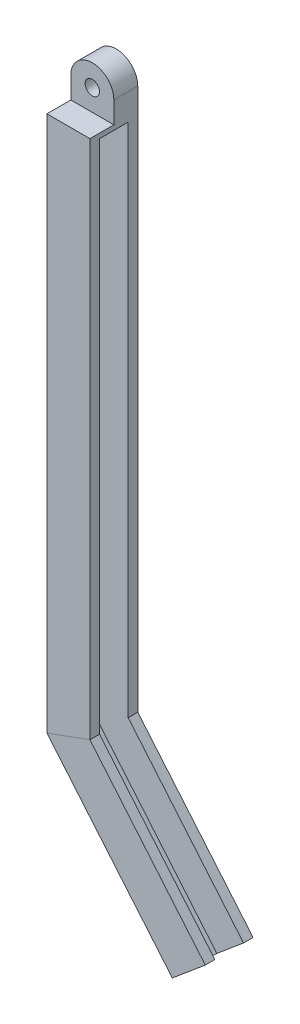
ISO-10303-21;
HEADER;
FILE_DESCRIPTION(('STEP AP214'),'2;1');
FILE_NAME('part.step','',(''),(''),'','','');
FILE_SCHEMA(('AUTOMOTIVE_DESIGN { 1 0 10303 214 1 1 1 1 }'));
ENDSEC;
DATA;
#1=APPLICATION_CONTEXT('core data for automotive mechanical design processes');
#2=APPLICATION_PROTOCOL_DEFINITION('international standard','automotive_design',2000,#1);
#3=PRODUCT_CONTEXT('',#1,'mechanical');
#4=PRODUCT('Part','Part','',(#3));
#5=PRODUCT_RELATED_PRODUCT_CATEGORY('part','',(#4));
#6=PRODUCT_DEFINITION_FORMATION('','',#4);
#7=PRODUCT_DEFINITION_CONTEXT('part definition',#1,'design');
#8=PRODUCT_DEFINITION('design','',#6,#7);
#9=PRODUCT_DEFINITION_SHAPE('','',#8);
#10=(LENGTH_UNIT() NAMED_UNIT(*) SI_UNIT(.MILLI.,.METRE.));
#11=(NAMED_UNIT(*) PLANE_ANGLE_UNIT() SI_UNIT($,.RADIAN.));
#12=(NAMED_UNIT(*) SI_UNIT($,.STERADIAN.) SOLID_ANGLE_UNIT());
#13=UNCERTAINTY_MEASURE_WITH_UNIT(LENGTH_MEASURE(1.E-05),#10,'distance_accuracy_value','');
#14=(GEOMETRIC_REPRESENTATION_CONTEXT(3) GLOBAL_UNCERTAINTY_ASSIGNED_CONTEXT((#13)) GLOBAL_UNIT_ASSIGNED_CONTEXT((#10,
#11,#12)) REPRESENTATION_CONTEXT('',''));
#15=CARTESIAN_POINT('',(0.,0.,0.));
#16=DIRECTION('',(0.,0.,1.));
#17=DIRECTION('',(1.,0.,0.));
#18=AXIS2_PLACEMENT_3D('',#15,#16,#17);
#19=CARTESIAN_POINT('',(-17.5751587734943,-105.650705303768,-1.04285714285714));
#20=DIRECTION('',(-0.766044443118977,-0.64278760968654,0.));
#21=DIRECTION('',(0.64278760968654,-0.766044443118977,0.));
#22=AXIS2_PLACEMENT_3D('',#19,#20,#21);
#23=PLANE('',#22);
#24=DIRECTION('',(0.,0.,-1.));
#25=VECTOR('',#24,1.);
#26=CARTESIAN_POINT('',(8.82018892935389,-137.107455756411,-1.04285714285714));
#27=LINE('',#26,#25);
#28=CARTESIAN_POINT('',(8.82018892935388,-137.107455756411,8.95714285714286));
#29=VERTEX_POINT('',#28);
#30=CARTESIAN_POINT('',(8.82018892935393,-137.107455756411,6.95714285714286));
#31=VERTEX_POINT('',#30);
#32=EDGE_CURVE('E289',#29,#31,#27,.T.);
#33=ORIENTED_EDGE('',*,*,#32,.T.);
#34=DIRECTION('',(0.64278760968654,-0.766044443118977,0.));
#35=VECTOR('',#34,1.);
#36=CARTESIAN_POINT('',(-16.8913154581077,-106.465678031652,6.95714285714286));
#37=LINE('',#36,#35);
#38=CARTESIAN_POINT('',(-15.3,-108.362133945802,6.95714285714286));
#39=VERTEX_POINT('',#38);
#40=EDGE_CURVE('E188',#39,#31,#37,.T.);
#41=ORIENTED_EDGE('',*,*,#40,.F.);
#42=DIRECTION('',(0.,0.,1.));
#43=VECTOR('',#42,1.);
#44=CARTESIAN_POINT('',(-15.3,-108.362133945802,-1.04285714285714));
#45=LINE('',#44,#43);
#46=CARTESIAN_POINT('',(-15.3,-108.362133945802,8.95714285714286));
#47=VERTEX_POINT('',#46);
#48=EDGE_CURVE('E279',#39,#47,#45,.T.);
#49=ORIENTED_EDGE('',*,*,#48,.T.);
#50=DIRECTION('',(0.64278760968654,-0.766044443118977,0.));
#51=VECTOR('',#50,1.);
#52=CARTESIAN_POINT('',(-17.5751587734943,-105.650705303768,8.95714285714286));
#53=LINE('',#52,#51);
#54=EDGE_CURVE('E305',#47,#29,#53,.T.);
#55=ORIENTED_EDGE('',*,*,#54,.T.);
#56=EDGE_LOOP('',(#33,#41,#49,#55));
#57=FACE_BOUND('',#56,.T.);
#58=ADVANCED_FACE('F39',(#57),#23,.F.);
#59=CARTESIAN_POINT('',(-15.3,10.,-1.04285714285714));
#60=DIRECTION('',(-1.,0.,0.));
#61=DIRECTION('',(0.,0.,1.));
#62=AXIS2_PLACEMENT_3D('',#59,#60,#61);
#63=PLANE('',#62);
#64=DIRECTION('',(0.,0.,-1.));
#65=VECTOR('',#64,1.);
#66=CARTESIAN_POINT('',(-15.3,-0.5,0.957142857142858));
#67=LINE('',#66,#65);
#68=CARTESIAN_POINT('',(-15.3,-0.5,6.95714285714286));
#69=VERTEX_POINT('',#68);
#70=CARTESIAN_POINT('',(-15.3,-0.5,0.957142857142858));
#71=VERTEX_POINT('',#70);
#72=EDGE_CURVE('E202',#69,#71,#67,.T.);
#73=ORIENTED_EDGE('',*,*,#72,.T.);
#74=DIRECTION('',(0.,1.,0.));
#75=VECTOR('',#74,1.);
#76=CARTESIAN_POINT('',(-15.3,-110.5,0.957142857142858));
#77=LINE('',#76,#75);
#78=CARTESIAN_POINT('',(-15.3,-108.362133945802,0.957142857142858));
#79=VERTEX_POINT('',#78);
#80=EDGE_CURVE('E223',#79,#71,#77,.T.);
#81=ORIENTED_EDGE('',*,*,#80,.F.);
#82=CARTESIAN_POINT('',(-15.3,-108.362133945802,-1.04285714285714));
#83=VERTEX_POINT('',#82);
#84=EDGE_CURVE('E275',#83,#79,#45,.T.);
#85=ORIENTED_EDGE('',*,*,#84,.F.);
#86=DIRECTION('',(0.,-1.,0.));
#87=VECTOR('',#86,1.);
#88=CARTESIAN_POINT('',(-15.3,10.,-1.04285714285714));
#89=LINE('',#88,#87);
#90=CARTESIAN_POINT('',(-15.3,5.,-1.04285714285714));
#91=VERTEX_POINT('',#90);
#92=EDGE_CURVE('E323',#91,#83,#89,.T.);
#93=ORIENTED_EDGE('',*,*,#92,.F.);
#94=DIRECTION('',(0.,0.,1.));
#95=VECTOR('',#94,1.);
#96=CARTESIAN_POINT('',(-15.3,5.,-1.04285714285714));
#97=LINE('',#96,#95);
#98=CARTESIAN_POINT('',(-15.3,5.,3.95714285714286));
#99=VERTEX_POINT('',#98);
#100=EDGE_CURVE('E313',#91,#99,#97,.T.);
#101=ORIENTED_EDGE('',*,*,#100,.T.);
#102=DIRECTION('',(0.,1.,0.));
#103=VECTOR('',#102,1.);
#104=CARTESIAN_POINT('',(-15.3,0.5,3.95714285714286));
#105=LINE('',#104,#103);
#106=CARTESIAN_POINT('',(-15.3,0.5,3.95714285714286));
#107=VERTEX_POINT('',#106);
#108=EDGE_CURVE('E62',#107,#99,#105,.T.);
#109=ORIENTED_EDGE('',*,*,#108,.F.);
#110=DIRECTION('',(0.,0.,-1.));
#111=VECTOR('',#110,1.);
#112=CARTESIAN_POINT('',(-15.3,0.5,13.9571428571429));
#113=LINE('',#112,#111);
#114=CARTESIAN_POINT('',(-15.3,0.5,8.95714285714286));
#115=VERTEX_POINT('',#114);
#116=EDGE_CURVE('E254',#115,#107,#113,.T.);
#117=ORIENTED_EDGE('',*,*,#116,.F.);
#118=DIRECTION('',(0.,-1.,0.));
#119=VECTOR('',#118,1.);
#120=CARTESIAN_POINT('',(-15.3,10.,8.95714285714286));
#121=LINE('',#120,#119);
#122=EDGE_CURVE('E326',#115,#47,#121,.T.);
#123=ORIENTED_EDGE('',*,*,#122,.T.);
#124=ORIENTED_EDGE('',*,*,#48,.F.);
#125=DIRECTION('',(0.,1.,0.));
#126=VECTOR('',#125,1.);
#127=CARTESIAN_POINT('',(-15.3,-110.5,6.95714285714286));
#128=LINE('',#127,#126);
#129=EDGE_CURVE('E227',#39,#69,#128,.T.);
#130=ORIENTED_EDGE('',*,*,#129,.T.);
#131=EDGE_LOOP('',(#73,#81,#85,#93,#101,#109,#117,#123,#124,#130));
#132=FACE_BOUND('',#131,.T.);
#133=ADVANCED_FACE('F342',(#132),#63,.F.);
#134=CARTESIAN_POINT('',(-24.3,10.,8.95714285714286));
#135=DIRECTION('',(1.,0.,0.));
#136=DIRECTION('',(0.,0.,-1.));
#137=AXIS2_PLACEMENT_3D('',#134,#135,#136);
#138=PLANE('',#137);
#139=DIRECTION('',(0.,0.,-1.));
#140=VECTOR('',#139,1.);
#141=CARTESIAN_POINT('',(-24.3,0.5,13.9571428571429));
#142=LINE('',#141,#140);
#143=CARTESIAN_POINT('',(-24.3,0.5,8.95714285714286));
#144=VERTEX_POINT('',#143);
#145=CARTESIAN_POINT('',(-24.3,0.5,3.95714285714286));
#146=VERTEX_POINT('',#145);
#147=EDGE_CURVE('E257',#144,#146,#142,.T.);
#148=ORIENTED_EDGE('',*,*,#147,.T.);
#149=DIRECTION('',(0.,-1.,0.));
#150=VECTOR('',#149,1.);
#151=CARTESIAN_POINT('',(-24.3,4.99999999999997,3.95714285714286));
#152=LINE('',#151,#150);
#153=CARTESIAN_POINT('',(-24.3,4.99999999999997,3.95714285714286));
#154=VERTEX_POINT('',#153);
#155=EDGE_CURVE('E246',#154,#146,#152,.T.);
#156=ORIENTED_EDGE('',*,*,#155,.F.);
#157=DIRECTION('',(0.,0.,1.));
#158=VECTOR('',#157,1.);
#159=CARTESIAN_POINT('',(-24.3,5.,-1.04285714285714));
#160=LINE('',#159,#158);
#161=CARTESIAN_POINT('',(-24.3,5.,-1.04285714285714));
#162=VERTEX_POINT('',#161);
#163=EDGE_CURVE('E312',#162,#154,#160,.T.);
#164=ORIENTED_EDGE('',*,*,#163,.F.);
#165=DIRECTION('',(0.,-1.,0.));
#166=VECTOR('',#165,1.);
#167=CARTESIAN_POINT('',(-24.3,10.,-1.04285714285714));
#168=LINE('',#167,#166);
#169=CARTESIAN_POINT('',(-24.3,-111.637866054198,-1.04285714285714));
#170=VERTEX_POINT('',#169);
#171=EDGE_CURVE('E317',#162,#170,#168,.T.);
#172=ORIENTED_EDGE('',*,*,#171,.T.);
#173=DIRECTION('',(0.,0.,-1.));
#174=VECTOR('',#173,1.);
#175=CARTESIAN_POINT('',(-24.3,-111.637866054198,8.95714285714284));
#176=LINE('',#175,#174);
#177=CARTESIAN_POINT('',(-24.3,-111.637866054198,8.95714285714286));
#178=VERTEX_POINT('',#177);
#179=EDGE_CURVE('E267',#178,#170,#176,.T.);
#180=ORIENTED_EDGE('',*,*,#179,.F.);
#181=DIRECTION('',(0.,-1.,0.));
#182=VECTOR('',#181,1.);
#183=CARTESIAN_POINT('',(-24.3,10.,8.95714285714286));
#184=LINE('',#183,#182);
#185=EDGE_CURVE('E330',#144,#178,#184,.T.);
#186=ORIENTED_EDGE('',*,*,#185,.F.);
#187=EDGE_LOOP('',(#148,#156,#164,#172,#180,#186));
#188=FACE_BOUND('',#187,.T.);
#189=ADVANCED_FACE('F41',(#188),#138,.F.);
#190=CARTESIAN_POINT('',(-15.3,10.,8.95714285714286));
#191=DIRECTION('',(0.,0.,-1.));
#192=DIRECTION('',(-1.,0.,0.));
#193=AXIS2_PLACEMENT_3D('',#190,#191,#192);
#194=PLANE('',#193);
#195=DIRECTION('',(1.,0.,0.));
#196=VECTOR('',#195,1.);
#197=CARTESIAN_POINT('',(-15.3,0.5,8.95714285714286));
#198=LINE('',#197,#196);
#199=EDGE_CURVE('E48',#144,#115,#198,.T.);
#200=ORIENTED_EDGE('',*,*,#199,.F.);
#201=ORIENTED_EDGE('',*,*,#185,.T.);
#202=DIRECTION('',(-0.939692620785908,-0.342020143325669,0.));
#203=VECTOR('',#202,1.);
#204=CARTESIAN_POINT('',(19.5269185297774,-95.686172249749,8.95714285714286));
#205=LINE('',#204,#203);
#206=EDGE_CURVE('E271',#47,#178,#205,.T.);
#207=ORIENTED_EDGE('',*,*,#206,.F.);
#208=ORIENTED_EDGE('',*,*,#122,.F.);
#209=EDGE_LOOP('',(#200,#201,#207,#208));
#210=FACE_BOUND('',#209,.T.);
#211=ADVANCED_FACE('F345',(#210),#194,.F.);
#212=CARTESIAN_POINT('',(-24.3,10.,-1.04285714285714));
#213=DIRECTION('',(0.,0.,1.));
#214=DIRECTION('',(1.,0.,0.));
#215=AXIS2_PLACEMENT_3D('',#212,#213,#214);
#216=PLANE('',#215);
#217=CARTESIAN_POINT('',(-19.8,4.99999999999998,-1.04285714285714));
#218=DIRECTION('',(0.,0.,1.));
#219=DIRECTION('',(1.,0.,0.));
#220=AXIS2_PLACEMENT_3D('',#217,#218,#219);
#221=CIRCLE('',#220,1.5);
#222=CARTESIAN_POINT('',(-18.3,4.99999999999998,-1.04285714285714));
#223=VERTEX_POINT('',#222);
#224=EDGE_CURVE('E239',#223,#223,#221,.T.);
#225=ORIENTED_EDGE('',*,*,#224,.T.);
#226=EDGE_LOOP('',(#225));
#227=FACE_BOUND('',#226,.T.);
#228=ORIENTED_EDGE('',*,*,#171,.F.);
#229=CARTESIAN_POINT('',(-19.8,5.,-1.04285714285714));
#230=DIRECTION('',(0.,0.,-1.));
#231=DIRECTION('',(-1.,0.,0.));
#232=AXIS2_PLACEMENT_3D('',#229,#230,#231);
#233=CIRCLE('',#232,4.5);
#234=EDGE_CURVE('E266',#162,#91,#233,.T.);
#235=ORIENTED_EDGE('',*,*,#234,.T.);
#236=ORIENTED_EDGE('',*,*,#92,.T.);
#237=DIRECTION('',(0.939692620785908,0.342020143325669,0.));
#238=VECTOR('',#237,1.);
#239=CARTESIAN_POINT('',(11.579718535742,-98.5787164933384,-1.04285714285714));
#240=LINE('',#239,#238);
#241=EDGE_CURVE('E262',#170,#83,#240,.T.);
#242=ORIENTED_EDGE('',*,*,#241,.F.);
#243=EDGE_LOOP('',(#228,#235,#236,#242));
#244=FACE_BOUND('',#243,.T.);
#245=ADVANCED_FACE('F370',(#227,#244),#216,.F.);
#246=CARTESIAN_POINT('',(-19.8,5.,-1.04285714285714));
#247=DIRECTION('',(0.,0.,1.));
#248=DIRECTION('',(1.,0.,0.));
#249=AXIS2_PLACEMENT_3D('',#246,#247,#248);
#250=CYLINDRICAL_SURFACE('',#249,4.5);
#251=ORIENTED_EDGE('',*,*,#163,.T.);
#252=CARTESIAN_POINT('',(-19.8,4.99999999999998,3.95714285714286));
#253=DIRECTION('',(0.,0.,1.));
#254=DIRECTION('',(-1.,0.,0.));
#255=AXIS2_PLACEMENT_3D('',#252,#253,#254);
#256=CIRCLE('',#255,4.5);
#257=EDGE_CURVE('E243',#99,#154,#256,.T.);
#258=ORIENTED_EDGE('',*,*,#257,.F.);
#259=ORIENTED_EDGE('',*,*,#100,.F.);
#260=ORIENTED_EDGE('',*,*,#234,.F.);
#261=EDGE_LOOP('',(#251,#258,#259,#260));
#262=FACE_BOUND('',#261,.T.);
#263=ADVANCED_FACE('F396',(#262),#250,.T.);
#264=CARTESIAN_POINT('',(20.5406689090742,-127.272805328207,0.));
#265=DIRECTION('',(0.64278760968654,-0.766044443118977,0.));
#266=DIRECTION('',(0.,0.,-1.));
#267=AXIS2_PLACEMENT_3D('',#264,#265,#266);
#268=PLANE('',#267);
#269=DIRECTION('',(-0.766044443118978,-0.64278760968654,0.));
#270=VECTOR('',#269,1.);
#271=CARTESIAN_POINT('',(3.23572493901658,-141.793377431026,6.95714285714286));
#272=LINE('',#271,#270);
#273=CARTESIAN_POINT('',(3.23572493901658,-141.793377431026,6.95714285714286));
#274=VERTEX_POINT('',#273);
#275=EDGE_CURVE('E168',#31,#274,#272,.T.);
#276=ORIENTED_EDGE('',*,*,#275,.F.);
#277=ORIENTED_EDGE('',*,*,#32,.F.);
#278=DIRECTION('',(0.766044443118977,0.64278760968654,0.));
#279=VECTOR('',#278,1.);
#280=CARTESIAN_POINT('',(8.82018892935389,-137.107455756411,8.95714285714286));
#281=LINE('',#280,#279);
#282=CARTESIAN_POINT('',(1.92578894128309,-142.892544243589,8.95714285714286));
#283=VERTEX_POINT('',#282);
#284=EDGE_CURVE('E261',#283,#29,#281,.T.);
#285=ORIENTED_EDGE('',*,*,#284,.F.);
#286=DIRECTION('',(0.,0.,1.));
#287=VECTOR('',#286,1.);
#288=CARTESIAN_POINT('',(1.92578894128309,-142.892544243589,8.95714285714286));
#289=LINE('',#288,#287);
#290=CARTESIAN_POINT('',(1.9257889412831,-142.892544243589,-1.04285714285714));
#291=VERTEX_POINT('',#290);
#292=EDGE_CURVE('E282',#291,#283,#289,.T.);
#293=ORIENTED_EDGE('',*,*,#292,.F.);
#294=DIRECTION('',(-0.766044443118977,-0.64278760968654,0.));
#295=VECTOR('',#294,1.);
#296=CARTESIAN_POINT('',(1.9257889412831,-142.892544243589,-1.04285714285714));
#297=LINE('',#296,#295);
#298=CARTESIAN_POINT('',(8.82018892935388,-137.107455756411,-1.04285714285714));
#299=VERTEX_POINT('',#298);
#300=EDGE_CURVE('E285',#299,#291,#297,.T.);
#301=ORIENTED_EDGE('',*,*,#300,.F.);
#302=CARTESIAN_POINT('',(8.82018892935393,-137.107455756411,0.957142857142858));
#303=VERTEX_POINT('',#302);
#304=EDGE_CURVE('E288',#303,#299,#27,.T.);
#305=ORIENTED_EDGE('',*,*,#304,.F.);
#306=DIRECTION('',(0.766044443118978,0.64278760968654,0.));
#307=VECTOR('',#306,1.);
#308=CARTESIAN_POINT('',(8.82018892935393,-137.107455756411,0.957142857142858));
#309=LINE('',#308,#307);
#310=CARTESIAN_POINT('',(3.23572493901658,-141.793377431026,0.957142857142858));
#311=VERTEX_POINT('',#310);
#312=EDGE_CURVE('E161',#311,#303,#309,.T.);
#313=ORIENTED_EDGE('',*,*,#312,.F.);
#314=DIRECTION('',(0.,0.,-1.));
#315=VECTOR('',#314,1.);
#316=CARTESIAN_POINT('',(3.23572493901658,-141.793377431026,0.957142857142858));
#317=LINE('',#316,#315);
#318=EDGE_CURVE('E183',#274,#311,#317,.T.);
#319=ORIENTED_EDGE('',*,*,#318,.F.);
#320=EDGE_LOOP('',(#276,#277,#285,#293,#301,#305,#313,#319));
#321=FACE_BOUND('',#320,.T.);
#322=ADVANCED_FACE('F363',(#321),#268,.T.);
#323=ORIENTED_EDGE('',*,*,#84,.T.);
#324=DIRECTION('',(0.64278760968654,-0.766044443118977,0.));
#325=VECTOR('',#324,1.);
#326=CARTESIAN_POINT('',(-16.8913154581077,-106.465678031652,0.957142857142858));
#327=LINE('',#326,#325);
#328=EDGE_CURVE('E192',#79,#303,#327,.T.);
#329=ORIENTED_EDGE('',*,*,#328,.T.);
#330=ORIENTED_EDGE('',*,*,#304,.T.);
#331=DIRECTION('',(0.64278760968654,-0.766044443118977,0.));
#332=VECTOR('',#331,1.);
#333=CARTESIAN_POINT('',(-17.5751587734943,-105.650705303768,-1.04285714285714));
#334=LINE('',#333,#332);
#335=EDGE_CURVE('E301',#83,#299,#334,.T.);
#336=ORIENTED_EDGE('',*,*,#335,.F.);
#337=EDGE_LOOP('',(#323,#329,#330,#336));
#338=FACE_BOUND('',#337,.T.);
#339=ADVANCED_FACE('F359',(#338),#23,.F.);
#340=CARTESIAN_POINT('',(-24.4695587615651,-111.435793790947,-1.04285714285714));
#341=DIRECTION('',(0.,0.,1.));
#342=DIRECTION('',(1.,0.,0.));
#343=AXIS2_PLACEMENT_3D('',#340,#341,#342);
#344=PLANE('',#343);
#345=ORIENTED_EDGE('',*,*,#241,.T.);
#346=ORIENTED_EDGE('',*,*,#335,.T.);
#347=ORIENTED_EDGE('',*,*,#300,.T.);
#348=DIRECTION('',(0.64278760968654,-0.766044443118977,0.));
#349=VECTOR('',#348,1.);
#350=CARTESIAN_POINT('',(-24.4695587615651,-111.435793790947,-1.04285714285714));
#351=LINE('',#350,#349);
#352=EDGE_CURVE('E297',#170,#291,#351,.T.);
#353=ORIENTED_EDGE('',*,*,#352,.F.);
#354=EDGE_LOOP('',(#345,#346,#347,#353));
#355=FACE_BOUND('',#354,.T.);
#356=ADVANCED_FACE('F366',(#355),#344,.F.);
#357=CARTESIAN_POINT('',(-24.4695587615651,-111.435793790947,8.95714285714286));
#358=DIRECTION('',(0.766044443118977,0.64278760968654,0.));
#359=DIRECTION('',(-0.64278760968654,0.766044443118977,0.));
#360=AXIS2_PLACEMENT_3D('',#357,#358,#359);
#361=PLANE('',#360);
#362=ORIENTED_EDGE('',*,*,#179,.T.);
#363=ORIENTED_EDGE('',*,*,#352,.T.);
#364=ORIENTED_EDGE('',*,*,#292,.T.);
#365=DIRECTION('',(0.64278760968654,-0.766044443118977,0.));
#366=VECTOR('',#365,1.);
#367=CARTESIAN_POINT('',(-24.4695587615651,-111.435793790947,8.95714285714286));
#368=LINE('',#367,#366);
#369=EDGE_CURVE('E293',#178,#283,#368,.T.);
#370=ORIENTED_EDGE('',*,*,#369,.F.);
#371=EDGE_LOOP('',(#362,#363,#364,#370));
#372=FACE_BOUND('',#371,.T.);
#373=ADVANCED_FACE('F391',(#372),#361,.F.);
#374=CARTESIAN_POINT('',(-17.5751587734943,-105.650705303768,8.95714285714286));
#375=DIRECTION('',(0.,0.,-1.));
#376=DIRECTION('',(-1.,0.,0.));
#377=AXIS2_PLACEMENT_3D('',#374,#375,#376);
#378=PLANE('',#377);
#379=ORIENTED_EDGE('',*,*,#206,.T.);
#380=ORIENTED_EDGE('',*,*,#369,.T.);
#381=ORIENTED_EDGE('',*,*,#284,.T.);
#382=ORIENTED_EDGE('',*,*,#54,.F.);
#383=EDGE_LOOP('',(#379,#380,#381,#382));
#384=FACE_BOUND('',#383,.T.);
#385=ADVANCED_FACE('F349',(#384),#378,.F.);
#386=CARTESIAN_POINT('',(-24.3,0.5,13.9571428571429));
#387=DIRECTION('',(0.,1.,0.));
#388=DIRECTION('',(0.,0.,1.));
#389=AXIS2_PLACEMENT_3D('',#386,#387,#388);
#390=PLANE('',#389);
#391=ORIENTED_EDGE('',*,*,#199,.T.);
#392=ORIENTED_EDGE('',*,*,#116,.T.);
#393=DIRECTION('',(1.,0.,0.));
#394=VECTOR('',#393,1.);
#395=CARTESIAN_POINT('',(-24.3,0.5,3.95714285714286));
#396=LINE('',#395,#394);
#397=EDGE_CURVE('E249',#146,#107,#396,.T.);
#398=ORIENTED_EDGE('',*,*,#397,.F.);
#399=ORIENTED_EDGE('',*,*,#147,.F.);
#400=EDGE_LOOP('',(#391,#392,#398,#399));
#401=FACE_BOUND('',#400,.T.);
#402=ADVANCED_FACE('F336',(#401),#390,.T.);
#403=CARTESIAN_POINT('',(-19.8,4.99999999999998,3.95714285714286));
#404=DIRECTION('',(0.,0.,-1.));
#405=DIRECTION('',(-1.,0.,0.));
#406=AXIS2_PLACEMENT_3D('',#403,#404,#405);
#407=PLANE('',#406);
#408=CARTESIAN_POINT('',(-19.8,4.99999999999998,3.95714285714286));
#409=DIRECTION('',(0.,0.,1.));
#410=DIRECTION('',(1.,0.,0.));
#411=AXIS2_PLACEMENT_3D('',#408,#409,#410);
#412=CIRCLE('',#411,1.5);
#413=CARTESIAN_POINT('',(-18.3,4.99999999999998,3.95714285714286));
#414=VERTEX_POINT('',#413);
#415=EDGE_CURVE('E226',#414,#414,#412,.T.);
#416=ORIENTED_EDGE('',*,*,#415,.F.);
#417=EDGE_LOOP('',(#416));
#418=FACE_BOUND('',#417,.T.);
#419=ORIENTED_EDGE('',*,*,#257,.T.);
#420=ORIENTED_EDGE('',*,*,#155,.T.);
#421=ORIENTED_EDGE('',*,*,#397,.T.);
#422=ORIENTED_EDGE('',*,*,#108,.T.);
#423=EDGE_LOOP('',(#419,#420,#421,#422));
#424=FACE_BOUND('',#423,.T.);
#425=ADVANCED_FACE('F397',(#418,#424),#407,.F.);
#426=CARTESIAN_POINT('',(-19.8,4.99999999999998,-6.04285714285714));
#427=DIRECTION('',(0.,0.,1.));
#428=DIRECTION('',(1.,0.,0.));
#429=AXIS2_PLACEMENT_3D('',#426,#427,#428);
#430=CYLINDRICAL_SURFACE('',#429,1.5);
#431=ORIENTED_EDGE('',*,*,#415,.T.);
#432=EDGE_LOOP('',(#431));
#433=FACE_BOUND('',#432,.T.);
#434=ORIENTED_EDGE('',*,*,#224,.F.);
#435=EDGE_LOOP('',(#434));
#436=FACE_BOUND('',#435,.T.);
#437=ADVANCED_FACE('F399',(#433,#436),#430,.F.);
#438=CARTESIAN_POINT('',(-22.59,-110.5,0.957142857142858));
#439=DIRECTION('',(0.,0.,-1.));
#440=DIRECTION('',(-1.,0.,0.));
#441=AXIS2_PLACEMENT_3D('',#438,#439,#440);
#442=PLANE('',#441);
#443=ORIENTED_EDGE('',*,*,#328,.F.);
#444=ORIENTED_EDGE('',*,*,#80,.T.);
#445=DIRECTION('',(-1.,0.,0.));
#446=VECTOR('',#445,1.);
#447=CARTESIAN_POINT('',(-22.59,-0.5,0.957142857142858));
#448=LINE('',#447,#446);
#449=CARTESIAN_POINT('',(-22.59,-0.5,0.957142857142858));
#450=VERTEX_POINT('',#449);
#451=EDGE_CURVE('E191',#71,#450,#448,.T.);
#452=ORIENTED_EDGE('',*,*,#451,.T.);
#453=DIRECTION('',(0.,1.,0.));
#454=VECTOR('',#453,1.);
#455=CARTESIAN_POINT('',(-22.59,-110.5,0.957142857142858));
#456=LINE('',#455,#454);
#457=CARTESIAN_POINT('',(-22.59,-110.5,0.957142857142858));
#458=VERTEX_POINT('',#457);
#459=EDGE_CURVE('E209',#458,#450,#456,.T.);
#460=ORIENTED_EDGE('',*,*,#459,.F.);
#461=DIRECTION('',(-1.,0.,0.));
#462=VECTOR('',#461,1.);
#463=CARTESIAN_POINT('',(-22.59,-110.5,0.957142857142858));
#464=LINE('',#463,#462);
#465=CARTESIAN_POINT('',(-21.6992331575687,-110.5,0.957142857142858));
#466=VERTEX_POINT('',#465);
#467=EDGE_CURVE('E198',#466,#458,#464,.T.);
#468=ORIENTED_EDGE('',*,*,#467,.F.);
#469=DIRECTION('',(0.766044443118978,0.64278760968654,0.));
#470=VECTOR('',#469,1.);
#471=CARTESIAN_POINT('',(-16.8913154581077,-106.465678031652,0.957142857142858));
#472=LINE('',#471,#470);
#473=CARTESIAN_POINT('',(-22.475779448445,-111.151599706266,0.957142857142858));
#474=VERTEX_POINT('',#473);
#475=EDGE_CURVE('E55',#474,#466,#472,.T.);
#476=ORIENTED_EDGE('',*,*,#475,.F.);
#477=DIRECTION('',(0.64278760968654,-0.766044443118977,0.));
#478=VECTOR('',#477,1.);
#479=CARTESIAN_POINT('',(-22.475779448445,-111.151599706266,0.957142857142858));
#480=LINE('',#479,#478);
#481=EDGE_CURVE('E173',#474,#311,#480,.T.);
#482=ORIENTED_EDGE('',*,*,#481,.T.);
#483=ORIENTED_EDGE('',*,*,#312,.T.);
#484=EDGE_LOOP('',(#443,#444,#452,#460,#468,#476,#482,#483));
#485=FACE_BOUND('',#484,.T.);
#486=ADVANCED_FACE('F377',(#485),#442,.F.);
#487=CARTESIAN_POINT('',(-15.3,-110.5,6.95714285714286));
#488=DIRECTION('',(0.,0.,1.));
#489=DIRECTION('',(1.,0.,0.));
#490=AXIS2_PLACEMENT_3D('',#487,#488,#489);
#491=PLANE('',#490);
#492=ORIENTED_EDGE('',*,*,#129,.F.);
#493=ORIENTED_EDGE('',*,*,#40,.T.);
#494=ORIENTED_EDGE('',*,*,#275,.T.);
#495=DIRECTION('',(0.64278760968654,-0.766044443118977,0.));
#496=VECTOR('',#495,1.);
#497=CARTESIAN_POINT('',(-22.475779448445,-111.151599706266,6.95714285714286));
#498=LINE('',#497,#496);
#499=CARTESIAN_POINT('',(-22.475779448445,-111.151599706266,6.95714285714286));
#500=VERTEX_POINT('',#499);
#501=EDGE_CURVE('E164',#500,#274,#498,.T.);
#502=ORIENTED_EDGE('',*,*,#501,.F.);
#503=DIRECTION('',(-0.766044443118978,-0.64278760968654,0.));
#504=VECTOR('',#503,1.);
#505=CARTESIAN_POINT('',(-22.475779448445,-111.151599706266,6.95714285714286));
#506=LINE('',#505,#504);
#507=CARTESIAN_POINT('',(-21.6992331575687,-110.5,6.95714285714286));
#508=VERTEX_POINT('',#507);
#509=EDGE_CURVE('E152',#508,#500,#506,.T.);
#510=ORIENTED_EDGE('',*,*,#509,.F.);
#511=DIRECTION('',(1.,0.,0.));
#512=VECTOR('',#511,1.);
#513=CARTESIAN_POINT('',(-15.3,-110.5,6.95714285714286));
#514=LINE('',#513,#512);
#515=CARTESIAN_POINT('',(-22.59,-110.5,6.95714285714286));
#516=VERTEX_POINT('',#515);
#517=EDGE_CURVE('E206',#516,#508,#514,.T.);
#518=ORIENTED_EDGE('',*,*,#517,.F.);
#519=DIRECTION('',(0.,1.,0.));
#520=VECTOR('',#519,1.);
#521=CARTESIAN_POINT('',(-22.59,-110.5,6.95714285714286));
#522=LINE('',#521,#520);
#523=CARTESIAN_POINT('',(-22.59,-0.5,6.95714285714286));
#524=VERTEX_POINT('',#523);
#525=EDGE_CURVE('E231',#516,#524,#522,.T.);
#526=ORIENTED_EDGE('',*,*,#525,.T.);
#527=DIRECTION('',(1.,0.,0.));
#528=VECTOR('',#527,1.);
#529=CARTESIAN_POINT('',(-15.3,-0.5,6.95714285714286));
#530=LINE('',#529,#528);
#531=EDGE_CURVE('E217',#524,#69,#530,.T.);
#532=ORIENTED_EDGE('',*,*,#531,.T.);
#533=EDGE_LOOP('',(#492,#493,#494,#502,#510,#518,#526,#532));
#534=FACE_BOUND('',#533,.T.);
#535=ADVANCED_FACE('F166',(#534),#491,.F.);
#536=CARTESIAN_POINT('',(-22.59,-110.5,6.95714285714286));
#537=DIRECTION('',(-1.,0.,0.));
#538=DIRECTION('',(0.,0.,1.));
#539=AXIS2_PLACEMENT_3D('',#536,#537,#538);
#540=PLANE('',#539);
#541=DIRECTION('',(0.,0.,1.));
#542=VECTOR('',#541,1.);
#543=CARTESIAN_POINT('',(-22.59,-0.5,6.95714285714286));
#544=LINE('',#543,#542);
#545=EDGE_CURVE('E213',#450,#524,#544,.T.);
#546=ORIENTED_EDGE('',*,*,#545,.T.);
#547=ORIENTED_EDGE('',*,*,#525,.F.);
#548=DIRECTION('',(0.,0.,1.));
#549=VECTOR('',#548,1.);
#550=CARTESIAN_POINT('',(-22.59,-110.5,6.95714285714286));
#551=LINE('',#550,#549);
#552=EDGE_CURVE('E201',#458,#516,#551,.T.);
#553=ORIENTED_EDGE('',*,*,#552,.F.);
#554=ORIENTED_EDGE('',*,*,#459,.T.);
#555=EDGE_LOOP('',(#546,#547,#553,#554));
#556=FACE_BOUND('',#555,.T.);
#557=ADVANCED_FACE('F384',(#556),#540,.F.);
#558=CARTESIAN_POINT('',(0.,-110.5,0.));
#559=DIRECTION('',(0.,-1.,0.));
#560=DIRECTION('',(0.,0.,-1.));
#561=AXIS2_PLACEMENT_3D('',#558,#559,#560);
#562=PLANE('',#561);
#563=ORIENTED_EDGE('',*,*,#517,.T.);
#564=DIRECTION('',(0.,0.,-1.));
#565=VECTOR('',#564,1.);
#566=CARTESIAN_POINT('',(-21.6992331575687,-110.5,0.));
#567=LINE('',#566,#565);
#568=EDGE_CURVE('E11',#508,#466,#567,.T.);
#569=ORIENTED_EDGE('',*,*,#568,.T.);
#570=ORIENTED_EDGE('',*,*,#467,.T.);
#571=ORIENTED_EDGE('',*,*,#552,.T.);
#572=EDGE_LOOP('',(#563,#569,#570,#571));
#573=FACE_BOUND('',#572,.T.);
#574=ADVANCED_FACE('F388',(#573),#562,.F.);
#575=CARTESIAN_POINT('',(0.,-0.5,0.));
#576=DIRECTION('',(0.,-1.,0.));
#577=DIRECTION('',(0.,0.,-1.));
#578=AXIS2_PLACEMENT_3D('',#575,#576,#577);
#579=PLANE('',#578);
#580=ORIENTED_EDGE('',*,*,#451,.F.);
#581=ORIENTED_EDGE('',*,*,#72,.F.);
#582=ORIENTED_EDGE('',*,*,#531,.F.);
#583=ORIENTED_EDGE('',*,*,#545,.F.);
#584=EDGE_LOOP('',(#580,#581,#582,#583));
#585=FACE_BOUND('',#584,.T.);
#586=ADVANCED_FACE('F381',(#585),#579,.T.);
#587=CARTESIAN_POINT('',(45.445027922431,-54.1592752921012,0.));
#588=DIRECTION('',(-0.64278760968654,0.766044443118978,0.));
#589=DIRECTION('',(-0.766044443118978,-0.64278760968654,0.));
#590=AXIS2_PLACEMENT_3D('',#587,#588,#589);
#591=PLANE('',#590);
#592=ORIENTED_EDGE('',*,*,#509,.T.);
#593=DIRECTION('',(0.,0.,-1.));
#594=VECTOR('',#593,1.);
#595=CARTESIAN_POINT('',(-22.475779448445,-111.151599706266,0.957142857142858));
#596=LINE('',#595,#594);
#597=EDGE_CURVE('E156',#500,#474,#596,.T.);
#598=ORIENTED_EDGE('',*,*,#597,.T.);
#599=ORIENTED_EDGE('',*,*,#475,.T.);
#600=ORIENTED_EDGE('',*,*,#568,.F.);
#601=EDGE_LOOP('',(#592,#598,#599,#600));
#602=FACE_BOUND('',#601,.T.);
#603=ADVANCED_FACE('F154',(#602),#591,.F.);
#604=CARTESIAN_POINT('',(-22.475779448445,-111.151599706266,0.957142857142858));
#605=DIRECTION('',(-0.766044443118977,-0.64278760968654,0.));
#606=DIRECTION('',(0.64278760968654,-0.766044443118977,0.));
#607=AXIS2_PLACEMENT_3D('',#604,#605,#606);
#608=PLANE('',#607);
#609=ORIENTED_EDGE('',*,*,#318,.T.);
#610=ORIENTED_EDGE('',*,*,#481,.F.);
#611=ORIENTED_EDGE('',*,*,#597,.F.);
#612=ORIENTED_EDGE('',*,*,#501,.T.);
#613=EDGE_LOOP('',(#609,#610,#611,#612));
#614=FACE_BOUND('',#613,.T.);
#615=ADVANCED_FACE('F175',(#614),#608,.F.);
#616=CLOSED_SHELL('',(#58,#133,#189,#211,#245,#263,#322,#339,#356,#373,#385,#402,#425,#437,#486,
#535,#557,#574,#586,#603,#615));
#617=MANIFOLD_SOLID_BREP('B2',#616);
#618=ADVANCED_BREP_SHAPE_REPRESENTATION('',(#18,#617),#14);
#619=SHAPE_DEFINITION_REPRESENTATION(#9,#618);
ENDSEC;
END-ISO-10303-21;
